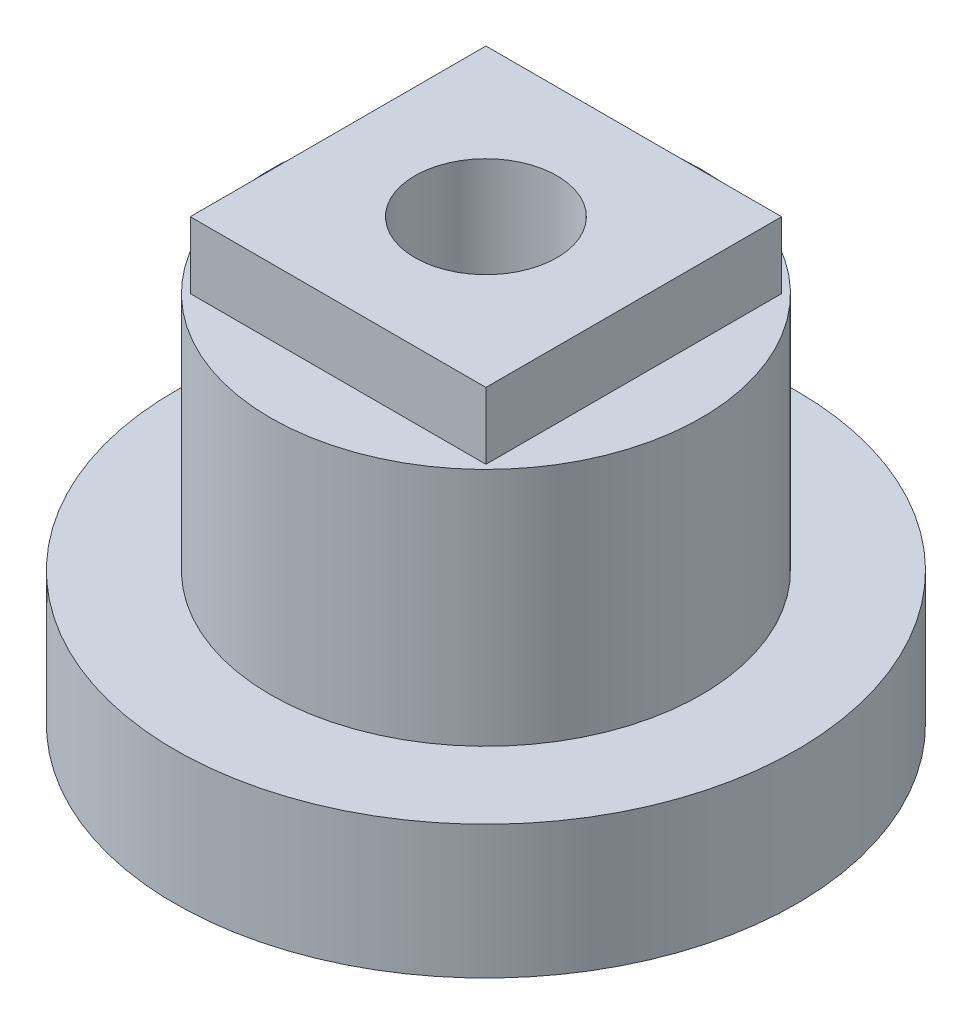
ISO-10303-21;
HEADER;
FILE_DESCRIPTION(('STEP AP214'),'2;1');
FILE_NAME('part.step','',(''),(''),'','','');
FILE_SCHEMA(('AUTOMOTIVE_DESIGN { 1 0 10303 214 1 1 1 1 }'));
ENDSEC;
DATA;
#1=APPLICATION_CONTEXT('core data for automotive mechanical design processes');
#2=APPLICATION_PROTOCOL_DEFINITION('international standard','automotive_design',2000,#1);
#3=PRODUCT_CONTEXT('',#1,'mechanical');
#4=PRODUCT('Part','Part','',(#3));
#5=PRODUCT_RELATED_PRODUCT_CATEGORY('part','',(#4));
#6=PRODUCT_DEFINITION_FORMATION('','',#4);
#7=PRODUCT_DEFINITION_CONTEXT('part definition',#1,'design');
#8=PRODUCT_DEFINITION('design','',#6,#7);
#9=PRODUCT_DEFINITION_SHAPE('','',#8);
#10=(LENGTH_UNIT() NAMED_UNIT(*) SI_UNIT(.MILLI.,.METRE.));
#11=(NAMED_UNIT(*) PLANE_ANGLE_UNIT() SI_UNIT($,.RADIAN.));
#12=(NAMED_UNIT(*) SI_UNIT($,.STERADIAN.) SOLID_ANGLE_UNIT());
#13=UNCERTAINTY_MEASURE_WITH_UNIT(LENGTH_MEASURE(1.E-05),#10,'distance_accuracy_value','');
#14=(GEOMETRIC_REPRESENTATION_CONTEXT(3) GLOBAL_UNCERTAINTY_ASSIGNED_CONTEXT((#13)) GLOBAL_UNIT_ASSIGNED_CONTEXT((#10,
#11,#12)) REPRESENTATION_CONTEXT('',''));
#15=CARTESIAN_POINT('',(0.,0.,0.));
#16=DIRECTION('',(0.,0.,1.));
#17=DIRECTION('',(1.,0.,0.));
#18=AXIS2_PLACEMENT_3D('',#15,#16,#17);
#19=CARTESIAN_POINT('',(1.6,0.,0.));
#20=DIRECTION('',(0.,-1.,0.));
#21=DIRECTION('',(0.,0.,-1.));
#22=AXIS2_PLACEMENT_3D('',#19,#20,#21);
#23=PLANE('',#22);
#24=CARTESIAN_POINT('',(0.,0.,0.));
#25=DIRECTION('',(0.,-1.,0.));
#26=DIRECTION('',(0.,0.,-1.));
#27=AXIS2_PLACEMENT_3D('',#24,#25,#26);
#28=CIRCLE('',#27,7.);
#29=CARTESIAN_POINT('',(0.,0.,-7.));
#30=VERTEX_POINT('',#29);
#31=EDGE_CURVE('E176',#30,#30,#28,.T.);
#32=ORIENTED_EDGE('',*,*,#31,.T.);
#33=EDGE_LOOP('',(#32));
#34=FACE_BOUND('',#33,.T.);
#35=DIRECTION('',(1.,0.,0.));
#36=VECTOR('',#35,1.);
#37=CARTESIAN_POINT('',(-2.325,0.,4.02701812759764));
#38=LINE('',#37,#36);
#39=CARTESIAN_POINT('',(-2.325,0.,4.02701812759764));
#40=VERTEX_POINT('',#39);
#41=CARTESIAN_POINT('',(2.325,0.,4.02701812759764));
#42=VERTEX_POINT('',#41);
#43=EDGE_CURVE('E131',#40,#42,#38,.T.);
#44=ORIENTED_EDGE('',*,*,#43,.T.);
#45=DIRECTION('',(0.5,0.,-0.866025403784439));
#46=VECTOR('',#45,1.);
#47=CARTESIAN_POINT('',(2.325,0.,4.02701812759764));
#48=LINE('',#47,#46);
#49=CARTESIAN_POINT('',(4.65,0.,0.));
#50=VERTEX_POINT('',#49);
#51=EDGE_CURVE('E53',#42,#50,#48,.T.);
#52=ORIENTED_EDGE('',*,*,#51,.T.);
#53=DIRECTION('',(-0.5,0.,-0.866025403784438));
#54=VECTOR('',#53,1.);
#55=CARTESIAN_POINT('',(4.65,0.,0.));
#56=LINE('',#55,#54);
#57=CARTESIAN_POINT('',(2.325,0.,-4.02701812759764));
#58=VERTEX_POINT('',#57);
#59=EDGE_CURVE('E135',#50,#58,#56,.T.);
#60=ORIENTED_EDGE('',*,*,#59,.T.);
#61=DIRECTION('',(-1.,0.,0.));
#62=VECTOR('',#61,1.);
#63=CARTESIAN_POINT('',(2.325,0.,-4.02701812759764));
#64=LINE('',#63,#62);
#65=CARTESIAN_POINT('',(-2.325,0.,-4.02701812759764));
#66=VERTEX_POINT('',#65);
#67=EDGE_CURVE('E385',#58,#66,#64,.T.);
#68=ORIENTED_EDGE('',*,*,#67,.T.);
#69=DIRECTION('',(-0.5,0.,0.866025403784439));
#70=VECTOR('',#69,1.);
#71=CARTESIAN_POINT('',(-2.325,0.,-4.02701812759764));
#72=LINE('',#71,#70);
#73=CARTESIAN_POINT('',(-4.65,0.,0.));
#74=VERTEX_POINT('',#73);
#75=EDGE_CURVE('E382',#66,#74,#72,.T.);
#76=ORIENTED_EDGE('',*,*,#75,.T.);
#77=DIRECTION('',(0.5,0.,0.866025403784439));
#78=VECTOR('',#77,1.);
#79=CARTESIAN_POINT('',(-4.65,0.,0.));
#80=LINE('',#79,#78);
#81=EDGE_CURVE('E376',#74,#40,#80,.T.);
#82=ORIENTED_EDGE('',*,*,#81,.T.);
#83=EDGE_LOOP('',(#44,#52,#60,#68,#76,#82));
#84=FACE_BOUND('',#83,.T.);
#85=ADVANCED_FACE('F37',(#34,#84),#23,.T.);
#86=CARTESIAN_POINT('',(4.85,8.4,0.));
#87=DIRECTION('',(0.,1.,0.));
#88=DIRECTION('',(0.,0.,1.));
#89=AXIS2_PLACEMENT_3D('',#86,#87,#88);
#90=PLANE('',#89);
#91=CARTESIAN_POINT('',(0.,8.39999999999996,0.));
#92=DIRECTION('',(0.,-1.,0.));
#93=DIRECTION('',(0.,0.,-1.));
#94=AXIS2_PLACEMENT_3D('',#91,#92,#93);
#95=CIRCLE('',#94,4.85);
#96=CARTESIAN_POINT('',(0.,8.39999999999996,-4.85));
#97=VERTEX_POINT('',#96);
#98=EDGE_CURVE('E179',#97,#97,#95,.T.);
#99=ORIENTED_EDGE('',*,*,#98,.F.);
#100=EDGE_LOOP('',(#99));
#101=FACE_BOUND('',#100,.T.);
#102=DIRECTION('',(1.,0.,0.));
#103=VECTOR('',#102,1.);
#104=CARTESIAN_POINT('',(0.,8.4,3.32946788875475));
#105=LINE('',#104,#103);
#106=CARTESIAN_POINT('',(-3.32946788875475,8.4,3.32946788875475));
#107=VERTEX_POINT('',#106);
#108=CARTESIAN_POINT('',(3.32946788875475,8.4,3.32946788875475));
#109=VERTEX_POINT('',#108);
#110=EDGE_CURVE('E159',#107,#109,#105,.T.);
#111=ORIENTED_EDGE('',*,*,#110,.F.);
#112=DIRECTION('',(0.,0.,-1.));
#113=VECTOR('',#112,1.);
#114=CARTESIAN_POINT('',(-3.32946788875475,8.4,0.));
#115=LINE('',#114,#113);
#116=CARTESIAN_POINT('',(-3.32946788875475,8.4,-3.32946788875475));
#117=VERTEX_POINT('',#116);
#118=EDGE_CURVE('E61',#107,#117,#115,.T.);
#119=ORIENTED_EDGE('',*,*,#118,.T.);
#120=DIRECTION('',(1.,0.,0.));
#121=VECTOR('',#120,1.);
#122=CARTESIAN_POINT('',(0.,8.4,-3.32946788875475));
#123=LINE('',#122,#121);
#124=CARTESIAN_POINT('',(3.32946788875475,8.4,-3.32946788875475));
#125=VERTEX_POINT('',#124);
#126=EDGE_CURVE('E147',#117,#125,#123,.T.);
#127=ORIENTED_EDGE('',*,*,#126,.T.);
#128=DIRECTION('',(0.,0.,-1.));
#129=VECTOR('',#128,1.);
#130=CARTESIAN_POINT('',(3.32946788875475,8.4,0.));
#131=LINE('',#130,#129);
#132=EDGE_CURVE('E162',#109,#125,#131,.T.);
#133=ORIENTED_EDGE('',*,*,#132,.F.);
#134=EDGE_LOOP('',(#111,#119,#127,#133));
#135=FACE_BOUND('',#134,.T.);
#136=ADVANCED_FACE('F202',(#101,#135),#90,.T.);
#137=CARTESIAN_POINT('',(0.,-1000.,0.));
#138=DIRECTION('',(0.,-1.,0.));
#139=DIRECTION('',(0.,0.,-1.));
#140=AXIS2_PLACEMENT_3D('',#137,#138,#139);
#141=CYLINDRICAL_SURFACE('',#140,7.);
#142=CARTESIAN_POINT('',(0.,2.99999999999989,0.));
#143=DIRECTION('',(0.,-1.,0.));
#144=DIRECTION('',(0.,0.,-1.));
#145=AXIS2_PLACEMENT_3D('',#142,#143,#144);
#146=CIRCLE('',#145,7.);
#147=CARTESIAN_POINT('',(0.,2.99999999999989,-7.));
#148=VERTEX_POINT('',#147);
#149=EDGE_CURVE('E11',#148,#148,#146,.T.);
#150=ORIENTED_EDGE('',*,*,#149,.T.);
#151=EDGE_LOOP('',(#150));
#152=FACE_BOUND('',#151,.T.);
#153=ORIENTED_EDGE('',*,*,#31,.F.);
#154=EDGE_LOOP('',(#153));
#155=FACE_BOUND('',#154,.T.);
#156=ADVANCED_FACE('F39',(#152,#155),#141,.T.);
#157=CARTESIAN_POINT('',(7.,3.,0.));
#158=DIRECTION('',(0.,1.,0.));
#159=DIRECTION('',(0.,0.,1.));
#160=AXIS2_PLACEMENT_3D('',#157,#158,#159);
#161=PLANE('',#160);
#162=CARTESIAN_POINT('',(0.,2.99999999999989,0.));
#163=DIRECTION('',(0.,-1.,0.));
#164=DIRECTION('',(0.,0.,-1.));
#165=AXIS2_PLACEMENT_3D('',#162,#163,#164);
#166=CIRCLE('',#165,4.85);
#167=CARTESIAN_POINT('',(0.,2.99999999999989,-4.85));
#168=VERTEX_POINT('',#167);
#169=EDGE_CURVE('E46',#168,#168,#166,.T.);
#170=ORIENTED_EDGE('',*,*,#169,.T.);
#171=EDGE_LOOP('',(#170));
#172=FACE_BOUND('',#171,.T.);
#173=ORIENTED_EDGE('',*,*,#149,.F.);
#174=EDGE_LOOP('',(#173));
#175=FACE_BOUND('',#174,.T.);
#176=ADVANCED_FACE('F185',(#172,#175),#161,.T.);
#177=CARTESIAN_POINT('',(0.,-1000.,0.));
#178=DIRECTION('',(0.,-1.,0.));
#179=DIRECTION('',(0.,0.,-1.));
#180=AXIS2_PLACEMENT_3D('',#177,#178,#179);
#181=CYLINDRICAL_SURFACE('',#180,4.85);
#182=ORIENTED_EDGE('',*,*,#98,.T.);
#183=EDGE_LOOP('',(#182));
#184=FACE_BOUND('',#183,.T.);
#185=ORIENTED_EDGE('',*,*,#169,.F.);
#186=EDGE_LOOP('',(#185));
#187=FACE_BOUND('',#186,.T.);
#188=ADVANCED_FACE('F188',(#184,#187),#181,.T.);
#189=CARTESIAN_POINT('',(0.,-1000.,0.));
#190=DIRECTION('',(0.,-1.,0.));
#191=DIRECTION('',(0.,0.,-1.));
#192=AXIS2_PLACEMENT_3D('',#189,#190,#191);
#193=CYLINDRICAL_SURFACE('',#192,1.6);
#194=CARTESIAN_POINT('',(0.,1.50000000000006,0.));
#195=DIRECTION('',(0.,1.,0.));
#196=DIRECTION('',(0.,0.,1.));
#197=AXIS2_PLACEMENT_3D('',#194,#195,#196);
#198=CIRCLE('',#197,1.6);
#199=CARTESIAN_POINT('',(0.,1.50000000000006,1.6));
#200=VERTEX_POINT('',#199);
#201=EDGE_CURVE('E41',#200,#200,#198,.T.);
#202=ORIENTED_EDGE('',*,*,#201,.F.);
#203=EDGE_LOOP('',(#202));
#204=FACE_BOUND('',#203,.T.);
#205=CARTESIAN_POINT('',(0.,9.9,0.));
#206=DIRECTION('',(0.,1.,0.));
#207=DIRECTION('',(0.,0.,1.));
#208=AXIS2_PLACEMENT_3D('',#205,#206,#207);
#209=CIRCLE('',#208,1.6);
#210=CARTESIAN_POINT('',(0.,9.9,1.6));
#211=VERTEX_POINT('',#210);
#212=EDGE_CURVE('E154',#211,#211,#209,.F.);
#213=ORIENTED_EDGE('',*,*,#212,.F.);
#214=EDGE_LOOP('',(#213));
#215=FACE_BOUND('',#214,.T.);
#216=ADVANCED_FACE('F190',(#204,#215),#193,.F.);
#217=CARTESIAN_POINT('',(-3.32946788875475,9.9,0.));
#218=DIRECTION('',(-1.,0.,0.));
#219=DIRECTION('',(0.,0.,1.));
#220=AXIS2_PLACEMENT_3D('',#217,#218,#219);
#221=PLANE('',#220);
#222=ORIENTED_EDGE('',*,*,#118,.F.);
#223=DIRECTION('',(0.,-1.,0.));
#224=VECTOR('',#223,1.);
#225=CARTESIAN_POINT('',(-3.32946788875475,9.9,3.32946788875475));
#226=LINE('',#225,#224);
#227=CARTESIAN_POINT('',(-3.32946788875475,9.9,3.32946788875475));
#228=VERTEX_POINT('',#227);
#229=EDGE_CURVE('E173',#228,#107,#226,.T.);
#230=ORIENTED_EDGE('',*,*,#229,.F.);
#231=DIRECTION('',(0.,0.,-1.));
#232=VECTOR('',#231,1.);
#233=CARTESIAN_POINT('',(-3.32946788875475,9.9,0.));
#234=LINE('',#233,#232);
#235=CARTESIAN_POINT('',(-3.32946788875475,9.9,-3.32946788875475));
#236=VERTEX_POINT('',#235);
#237=EDGE_CURVE('E143',#228,#236,#234,.T.);
#238=ORIENTED_EDGE('',*,*,#237,.T.);
#239=DIRECTION('',(0.,-1.,0.));
#240=VECTOR('',#239,1.);
#241=CARTESIAN_POINT('',(-3.32946788875475,9.9,-3.32946788875475));
#242=LINE('',#241,#240);
#243=EDGE_CURVE('E157',#236,#117,#242,.T.);
#244=ORIENTED_EDGE('',*,*,#243,.T.);
#245=EDGE_LOOP('',(#222,#230,#238,#244));
#246=FACE_BOUND('',#245,.T.);
#247=ADVANCED_FACE('F197',(#246),#221,.T.);
#248=CARTESIAN_POINT('',(0.,9.9,3.32946788875475));
#249=DIRECTION('',(0.,0.,-1.));
#250=DIRECTION('',(-1.,0.,0.));
#251=AXIS2_PLACEMENT_3D('',#248,#249,#250);
#252=PLANE('',#251);
#253=ORIENTED_EDGE('',*,*,#110,.T.);
#254=DIRECTION('',(0.,-1.,0.));
#255=VECTOR('',#254,1.);
#256=CARTESIAN_POINT('',(3.32946788875475,9.9,3.32946788875475));
#257=LINE('',#256,#255);
#258=CARTESIAN_POINT('',(3.32946788875475,9.9,3.32946788875475));
#259=VERTEX_POINT('',#258);
#260=EDGE_CURVE('E170',#259,#109,#257,.T.);
#261=ORIENTED_EDGE('',*,*,#260,.F.);
#262=DIRECTION('',(1.,0.,0.));
#263=VECTOR('',#262,1.);
#264=CARTESIAN_POINT('',(0.,9.9,3.32946788875475));
#265=LINE('',#264,#263);
#266=EDGE_CURVE('E146',#228,#259,#265,.T.);
#267=ORIENTED_EDGE('',*,*,#266,.F.);
#268=ORIENTED_EDGE('',*,*,#229,.T.);
#269=EDGE_LOOP('',(#253,#261,#267,#268));
#270=FACE_BOUND('',#269,.T.);
#271=ADVANCED_FACE('F213',(#270),#252,.F.);
#272=CARTESIAN_POINT('',(3.32946788875475,9.9,0.));
#273=DIRECTION('',(-1.,0.,0.));
#274=DIRECTION('',(0.,0.,1.));
#275=AXIS2_PLACEMENT_3D('',#272,#273,#274);
#276=PLANE('',#275);
#277=ORIENTED_EDGE('',*,*,#132,.T.);
#278=DIRECTION('',(0.,-1.,0.));
#279=VECTOR('',#278,1.);
#280=CARTESIAN_POINT('',(3.32946788875475,9.9,-3.32946788875475));
#281=LINE('',#280,#279);
#282=CARTESIAN_POINT('',(3.32946788875475,9.9,-3.32946788875475));
#283=VERTEX_POINT('',#282);
#284=EDGE_CURVE('E167',#283,#125,#281,.T.);
#285=ORIENTED_EDGE('',*,*,#284,.F.);
#286=DIRECTION('',(0.,0.,-1.));
#287=VECTOR('',#286,1.);
#288=CARTESIAN_POINT('',(3.32946788875475,9.9,0.));
#289=LINE('',#288,#287);
#290=EDGE_CURVE('E149',#259,#283,#289,.T.);
#291=ORIENTED_EDGE('',*,*,#290,.F.);
#292=ORIENTED_EDGE('',*,*,#260,.T.);
#293=EDGE_LOOP('',(#277,#285,#291,#292));
#294=FACE_BOUND('',#293,.T.);
#295=ADVANCED_FACE('F217',(#294),#276,.F.);
#296=CARTESIAN_POINT('',(0.,9.9,-3.32946788875475));
#297=DIRECTION('',(0.,0.,-1.));
#298=DIRECTION('',(-1.,0.,0.));
#299=AXIS2_PLACEMENT_3D('',#296,#297,#298);
#300=PLANE('',#299);
#301=ORIENTED_EDGE('',*,*,#126,.F.);
#302=ORIENTED_EDGE('',*,*,#243,.F.);
#303=DIRECTION('',(1.,0.,0.));
#304=VECTOR('',#303,1.);
#305=CARTESIAN_POINT('',(0.,9.9,-3.32946788875475));
#306=LINE('',#305,#304);
#307=EDGE_CURVE('E151',#236,#283,#306,.T.);
#308=ORIENTED_EDGE('',*,*,#307,.T.);
#309=ORIENTED_EDGE('',*,*,#284,.T.);
#310=EDGE_LOOP('',(#301,#302,#308,#309));
#311=FACE_BOUND('',#310,.T.);
#312=ADVANCED_FACE('F221',(#311),#300,.T.);
#313=CARTESIAN_POINT('',(0.,9.9,0.));
#314=DIRECTION('',(0.,1.,0.));
#315=DIRECTION('',(0.,0.,1.));
#316=AXIS2_PLACEMENT_3D('',#313,#314,#315);
#317=PLANE('',#316);
#318=ORIENTED_EDGE('',*,*,#237,.F.);
#319=ORIENTED_EDGE('',*,*,#266,.T.);
#320=ORIENTED_EDGE('',*,*,#290,.T.);
#321=ORIENTED_EDGE('',*,*,#307,.F.);
#322=EDGE_LOOP('',(#318,#319,#320,#321));
#323=FACE_BOUND('',#322,.T.);
#324=ORIENTED_EDGE('',*,*,#212,.T.);
#325=EDGE_LOOP('',(#324));
#326=FACE_BOUND('',#325,.T.);
#327=ADVANCED_FACE('F225',(#323,#326),#317,.T.);
#328=CARTESIAN_POINT('',(2.325,1.5,4.02701812759764));
#329=DIRECTION('',(-0.866025403784439,0.,-0.5));
#330=DIRECTION('',(-0.5,0.,0.866025403784439));
#331=AXIS2_PLACEMENT_3D('',#328,#329,#330);
#332=PLANE('',#331);
#333=ORIENTED_EDGE('',*,*,#51,.F.);
#334=DIRECTION('',(0.,-1.,0.));
#335=VECTOR('',#334,1.);
#336=CARTESIAN_POINT('',(2.325,1.5,4.02701812759764));
#337=LINE('',#336,#335);
#338=CARTESIAN_POINT('',(2.325,1.5,4.02701812759764));
#339=VERTEX_POINT('',#338);
#340=EDGE_CURVE('E130',#339,#42,#337,.T.);
#341=ORIENTED_EDGE('',*,*,#340,.F.);
#342=DIRECTION('',(0.5,0.,-0.866025403784439));
#343=VECTOR('',#342,1.);
#344=CARTESIAN_POINT('',(2.325,1.5,4.02701812759764));
#345=LINE('',#344,#343);
#346=CARTESIAN_POINT('',(4.65,1.5,0.));
#347=VERTEX_POINT('',#346);
#348=EDGE_CURVE('E121',#339,#347,#345,.T.);
#349=ORIENTED_EDGE('',*,*,#348,.T.);
#350=DIRECTION('',(0.,-1.,0.));
#351=VECTOR('',#350,1.);
#352=CARTESIAN_POINT('',(4.65,1.5,0.));
#353=LINE('',#352,#351);
#354=EDGE_CURVE('E129',#347,#50,#353,.T.);
#355=ORIENTED_EDGE('',*,*,#354,.T.);
#356=EDGE_LOOP('',(#333,#341,#349,#355));
#357=FACE_BOUND('',#356,.T.);
#358=ADVANCED_FACE('F128',(#357),#332,.T.);
#359=CARTESIAN_POINT('',(4.65,1.5,0.));
#360=DIRECTION('',(-0.866025403784439,0.,0.5));
#361=DIRECTION('',(0.5,0.,0.866025403784439));
#362=AXIS2_PLACEMENT_3D('',#359,#360,#361);
#363=PLANE('',#362);
#364=ORIENTED_EDGE('',*,*,#59,.F.);
#365=ORIENTED_EDGE('',*,*,#354,.F.);
#366=DIRECTION('',(-0.5,0.,-0.866025403784438));
#367=VECTOR('',#366,1.);
#368=CARTESIAN_POINT('',(4.65,1.5,0.));
#369=LINE('',#368,#367);
#370=CARTESIAN_POINT('',(2.325,1.5,-4.02701812759764));
#371=VERTEX_POINT('',#370);
#372=EDGE_CURVE('E117',#347,#371,#369,.T.);
#373=ORIENTED_EDGE('',*,*,#372,.T.);
#374=DIRECTION('',(0.,-1.,0.));
#375=VECTOR('',#374,1.);
#376=CARTESIAN_POINT('',(2.325,1.5,-4.02701812759764));
#377=LINE('',#376,#375);
#378=EDGE_CURVE('E136',#371,#58,#377,.T.);
#379=ORIENTED_EDGE('',*,*,#378,.T.);
#380=EDGE_LOOP('',(#364,#365,#373,#379));
#381=FACE_BOUND('',#380,.T.);
#382=ADVANCED_FACE('F133',(#381),#363,.T.);
#383=CARTESIAN_POINT('',(2.325,1.5,-4.02701812759764));
#384=DIRECTION('',(0.,0.,1.));
#385=DIRECTION('',(1.,0.,0.));
#386=AXIS2_PLACEMENT_3D('',#383,#384,#385);
#387=PLANE('',#386);
#388=ORIENTED_EDGE('',*,*,#67,.F.);
#389=ORIENTED_EDGE('',*,*,#378,.F.);
#390=DIRECTION('',(-1.,0.,0.));
#391=VECTOR('',#390,1.);
#392=CARTESIAN_POINT('',(2.325,1.5,-4.02701812759764));
#393=LINE('',#392,#391);
#394=CARTESIAN_POINT('',(-2.325,1.5,-4.02701812759764));
#395=VERTEX_POINT('',#394);
#396=EDGE_CURVE('E123',#371,#395,#393,.T.);
#397=ORIENTED_EDGE('',*,*,#396,.T.);
#398=DIRECTION('',(0.,-1.,0.));
#399=VECTOR('',#398,1.);
#400=CARTESIAN_POINT('',(-2.325,1.5,-4.02701812759764));
#401=LINE('',#400,#399);
#402=EDGE_CURVE('E139',#395,#66,#401,.T.);
#403=ORIENTED_EDGE('',*,*,#402,.T.);
#404=EDGE_LOOP('',(#388,#389,#397,#403));
#405=FACE_BOUND('',#404,.T.);
#406=ADVANCED_FACE('F234',(#405),#387,.T.);
#407=CARTESIAN_POINT('',(-2.325,1.5,-4.02701812759764));
#408=DIRECTION('',(0.866025403784439,0.,0.5));
#409=DIRECTION('',(0.5,0.,-0.866025403784439));
#410=AXIS2_PLACEMENT_3D('',#407,#408,#409);
#411=PLANE('',#410);
#412=ORIENTED_EDGE('',*,*,#75,.F.);
#413=ORIENTED_EDGE('',*,*,#402,.F.);
#414=DIRECTION('',(-0.5,0.,0.866025403784439));
#415=VECTOR('',#414,1.);
#416=CARTESIAN_POINT('',(-2.325,1.5,-4.02701812759764));
#417=LINE('',#416,#415);
#418=CARTESIAN_POINT('',(-4.65,1.5,0.));
#419=VERTEX_POINT('',#418);
#420=EDGE_CURVE('E401',#395,#419,#417,.T.);
#421=ORIENTED_EDGE('',*,*,#420,.T.);
#422=DIRECTION('',(0.,-1.,0.));
#423=VECTOR('',#422,1.);
#424=CARTESIAN_POINT('',(-4.65,1.5,0.));
#425=LINE('',#424,#423);
#426=EDGE_CURVE('E392',#419,#74,#425,.T.);
#427=ORIENTED_EDGE('',*,*,#426,.T.);
#428=EDGE_LOOP('',(#412,#413,#421,#427));
#429=FACE_BOUND('',#428,.T.);
#430=ADVANCED_FACE('F237',(#429),#411,.T.);
#431=CARTESIAN_POINT('',(-4.65,1.5,0.));
#432=DIRECTION('',(0.866025403784439,0.,-0.5));
#433=DIRECTION('',(-0.5,0.,-0.866025403784439));
#434=AXIS2_PLACEMENT_3D('',#431,#432,#433);
#435=PLANE('',#434);
#436=ORIENTED_EDGE('',*,*,#81,.F.);
#437=ORIENTED_EDGE('',*,*,#426,.F.);
#438=DIRECTION('',(0.5,0.,0.866025403784439));
#439=VECTOR('',#438,1.);
#440=CARTESIAN_POINT('',(-4.65,1.5,0.));
#441=LINE('',#440,#439);
#442=CARTESIAN_POINT('',(-2.325,1.5,4.02701812759764));
#443=VERTEX_POINT('',#442);
#444=EDGE_CURVE('E399',#419,#443,#441,.T.);
#445=ORIENTED_EDGE('',*,*,#444,.T.);
#446=DIRECTION('',(0.,-1.,0.));
#447=VECTOR('',#446,1.);
#448=CARTESIAN_POINT('',(-2.325,1.5,4.02701812759764));
#449=LINE('',#448,#447);
#450=EDGE_CURVE('E375',#443,#40,#449,.T.);
#451=ORIENTED_EDGE('',*,*,#450,.T.);
#452=EDGE_LOOP('',(#436,#437,#445,#451));
#453=FACE_BOUND('',#452,.T.);
#454=ADVANCED_FACE('F241',(#453),#435,.T.);
#455=CARTESIAN_POINT('',(-2.325,1.5,4.02701812759764));
#456=DIRECTION('',(0.,0.,-1.));
#457=DIRECTION('',(-1.,0.,0.));
#458=AXIS2_PLACEMENT_3D('',#455,#456,#457);
#459=PLANE('',#458);
#460=ORIENTED_EDGE('',*,*,#43,.F.);
#461=ORIENTED_EDGE('',*,*,#450,.F.);
#462=DIRECTION('',(1.,0.,0.));
#463=VECTOR('',#462,1.);
#464=CARTESIAN_POINT('',(-2.325,1.5,4.02701812759764));
#465=LINE('',#464,#463);
#466=EDGE_CURVE('E390',#443,#339,#465,.T.);
#467=ORIENTED_EDGE('',*,*,#466,.T.);
#468=ORIENTED_EDGE('',*,*,#340,.T.);
#469=EDGE_LOOP('',(#460,#461,#467,#468));
#470=FACE_BOUND('',#469,.T.);
#471=ADVANCED_FACE('F245',(#470),#459,.T.);
#472=CARTESIAN_POINT('',(0.,1.5,0.));
#473=DIRECTION('',(0.,1.,0.));
#474=DIRECTION('',(0.,0.,1.));
#475=AXIS2_PLACEMENT_3D('',#472,#473,#474);
#476=PLANE('',#475);
#477=ORIENTED_EDGE('',*,*,#201,.T.);
#478=EDGE_LOOP('',(#477));
#479=FACE_BOUND('',#478,.T.);
#480=ORIENTED_EDGE('',*,*,#348,.F.);
#481=ORIENTED_EDGE('',*,*,#466,.F.);
#482=ORIENTED_EDGE('',*,*,#444,.F.);
#483=ORIENTED_EDGE('',*,*,#420,.F.);
#484=ORIENTED_EDGE('',*,*,#396,.F.);
#485=ORIENTED_EDGE('',*,*,#372,.F.);
#486=EDGE_LOOP('',(#480,#481,#482,#483,#484,#485));
#487=FACE_BOUND('',#486,.T.);
#488=ADVANCED_FACE('F119',(#479,#487),#476,.F.);
#489=CLOSED_SHELL('',(#85,#136,#156,#176,#188,#216,#247,#271,#295,#312,#327,#358,#382,#406,#430,
#454,#471,#488));
#490=MANIFOLD_SOLID_BREP('B2',#489);
#491=ADVANCED_BREP_SHAPE_REPRESENTATION('',(#18,#490),#14);
#492=SHAPE_DEFINITION_REPRESENTATION(#9,#491);
ENDSEC;
END-ISO-10303-21;
